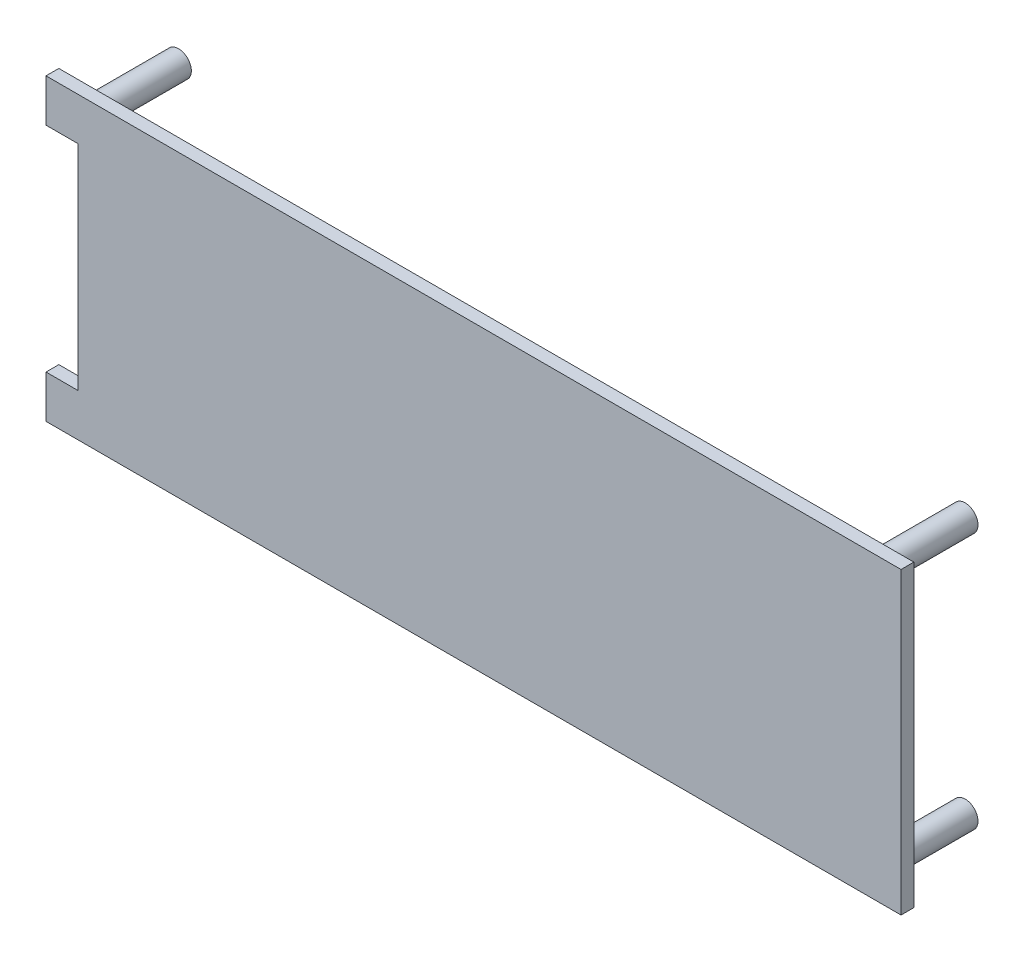
ISO-10303-21;
HEADER;
FILE_DESCRIPTION(('STEP AP214'),'2;1');
FILE_NAME('part.step','',(''),(''),'','','');
FILE_SCHEMA(('AUTOMOTIVE_DESIGN { 1 0 10303 214 1 1 1 1 }'));
ENDSEC;
DATA;
#1=APPLICATION_CONTEXT('core data for automotive mechanical design processes');
#2=APPLICATION_PROTOCOL_DEFINITION('international standard','automotive_design',2000,#1);
#3=PRODUCT_CONTEXT('',#1,'mechanical');
#4=PRODUCT('Part','Part','',(#3));
#5=PRODUCT_RELATED_PRODUCT_CATEGORY('part','',(#4));
#6=PRODUCT_DEFINITION_FORMATION('','',#4);
#7=PRODUCT_DEFINITION_CONTEXT('part definition',#1,'design');
#8=PRODUCT_DEFINITION('design','',#6,#7);
#9=PRODUCT_DEFINITION_SHAPE('','',#8);
#10=(LENGTH_UNIT() NAMED_UNIT(*) SI_UNIT(.MILLI.,.METRE.));
#11=(NAMED_UNIT(*) PLANE_ANGLE_UNIT() SI_UNIT($,.RADIAN.));
#12=(NAMED_UNIT(*) SI_UNIT($,.STERADIAN.) SOLID_ANGLE_UNIT());
#13=UNCERTAINTY_MEASURE_WITH_UNIT(LENGTH_MEASURE(1.E-05),#10,'distance_accuracy_value','');
#14=(GEOMETRIC_REPRESENTATION_CONTEXT(3) GLOBAL_UNCERTAINTY_ASSIGNED_CONTEXT((#13)) GLOBAL_UNIT_ASSIGNED_CONTEXT((#10,
#11,#12)) REPRESENTATION_CONTEXT('',''));
#15=CARTESIAN_POINT('',(0.,0.,0.));
#16=DIRECTION('',(0.,0.,1.));
#17=DIRECTION('',(1.,0.,0.));
#18=AXIS2_PLACEMENT_3D('',#15,#16,#17);
#19=CARTESIAN_POINT('',(0.,35.,23.));
#20=DIRECTION('',(1.,0.,0.));
#21=DIRECTION('',(0.,0.,-1.));
#22=AXIS2_PLACEMENT_3D('',#19,#20,#21);
#23=PLANE('',#22);
#24=DIRECTION('',(0.,-1.,0.));
#25=VECTOR('',#24,1.);
#26=CARTESIAN_POINT('',(0.,35.,23.));
#27=LINE('',#26,#25);
#28=CARTESIAN_POINT('',(0.,-25.,23.));
#29=VERTEX_POINT('',#28);
#30=CARTESIAN_POINT('',(0.,-35.,23.));
#31=VERTEX_POINT('',#30);
#32=EDGE_CURVE('E84',#29,#31,#27,.T.);
#33=ORIENTED_EDGE('',*,*,#32,.F.);
#34=DIRECTION('',(0.,0.,-1.));
#35=VECTOR('',#34,1.);
#36=CARTESIAN_POINT('',(0.,-25.,23.));
#37=LINE('',#36,#35);
#38=CARTESIAN_POINT('',(0.,-25.,20.));
#39=VERTEX_POINT('',#38);
#40=EDGE_CURVE('E135',#29,#39,#37,.T.);
#41=ORIENTED_EDGE('',*,*,#40,.T.);
#42=DIRECTION('',(0.,-1.,0.));
#43=VECTOR('',#42,1.);
#44=CARTESIAN_POINT('',(0.,35.,20.));
#45=LINE('',#44,#43);
#46=CARTESIAN_POINT('',(0.,-35.,20.));
#47=VERTEX_POINT('',#46);
#48=EDGE_CURVE('E147',#39,#47,#45,.T.);
#49=ORIENTED_EDGE('',*,*,#48,.T.);
#50=DIRECTION('',(0.,0.,-1.));
#51=VECTOR('',#50,1.);
#52=CARTESIAN_POINT('',(0.,-35.,23.));
#53=LINE('',#52,#51);
#54=EDGE_CURVE('E169',#31,#47,#53,.T.);
#55=ORIENTED_EDGE('',*,*,#54,.F.);
#56=EDGE_LOOP('',(#33,#41,#49,#55));
#57=FACE_BOUND('',#56,.T.);
#58=ADVANCED_FACE('F32',(#57),#23,.F.);
#59=CARTESIAN_POINT('',(192.,-30.,20.));
#60=DIRECTION('',(0.,0.,-1.));
#61=DIRECTION('',(-1.,0.,0.));
#62=AXIS2_PLACEMENT_3D('',#59,#60,#61);
#63=CYLINDRICAL_SURFACE('',#62,2.99999999999999);
#64=CARTESIAN_POINT('',(192.,-30.,20.));
#65=DIRECTION('',(0.,0.,1.));
#66=DIRECTION('',(1.,0.,0.));
#67=AXIS2_PLACEMENT_3D('',#64,#65,#66);
#68=CIRCLE('',#67,2.99999999999999);
#69=CARTESIAN_POINT('',(195.,-30.,20.));
#70=VERTEX_POINT('',#69);
#71=EDGE_CURVE('E173',#70,#70,#68,.T.);
#72=ORIENTED_EDGE('',*,*,#71,.F.);
#73=EDGE_LOOP('',(#72));
#74=FACE_BOUND('',#73,.T.);
#75=CARTESIAN_POINT('',(192.,-30.,0.));
#76=DIRECTION('',(0.,0.,1.));
#77=DIRECTION('',(1.,0.,0.));
#78=AXIS2_PLACEMENT_3D('',#75,#76,#77);
#79=CIRCLE('',#78,2.99999999999999);
#80=CARTESIAN_POINT('',(195.,-30.,0.));
#81=VERTEX_POINT('',#80);
#82=EDGE_CURVE('E172',#81,#81,#79,.T.);
#83=ORIENTED_EDGE('',*,*,#82,.T.);
#84=EDGE_LOOP('',(#83));
#85=FACE_BOUND('',#84,.T.);
#86=ADVANCED_FACE('F34',(#74,#85),#63,.T.);
#87=CARTESIAN_POINT('',(192.,-30.,0.));
#88=DIRECTION('',(0.,0.,1.));
#89=DIRECTION('',(1.,0.,0.));
#90=AXIS2_PLACEMENT_3D('',#87,#88,#89);
#91=PLANE('',#90);
#92=ORIENTED_EDGE('',*,*,#82,.F.);
#93=EDGE_LOOP('',(#92));
#94=FACE_BOUND('',#93,.T.);
#95=ADVANCED_FACE('F202',(#94),#91,.F.);
#96=CARTESIAN_POINT('',(0.,35.,20.));
#97=VERTEX_POINT('',#96);
#98=CARTESIAN_POINT('',(0.,25.,20.));
#99=VERTEX_POINT('',#98);
#100=EDGE_CURVE('E156',#97,#99,#45,.T.);
#101=ORIENTED_EDGE('',*,*,#100,.T.);
#102=DIRECTION('',(0.,0.,1.));
#103=VECTOR('',#102,1.);
#104=CARTESIAN_POINT('',(0.,25.,23.));
#105=LINE('',#104,#103);
#106=CARTESIAN_POINT('',(0.,25.,23.));
#107=VERTEX_POINT('',#106);
#108=EDGE_CURVE('E47',#99,#107,#105,.T.);
#109=ORIENTED_EDGE('',*,*,#108,.T.);
#110=CARTESIAN_POINT('',(0.,35.,23.));
#111=VERTEX_POINT('',#110);
#112=EDGE_CURVE('E148',#111,#107,#27,.T.);
#113=ORIENTED_EDGE('',*,*,#112,.F.);
#114=DIRECTION('',(0.,0.,-1.));
#115=VECTOR('',#114,1.);
#116=CARTESIAN_POINT('',(0.,35.,23.));
#117=LINE('',#116,#115);
#118=EDGE_CURVE('E155',#111,#97,#117,.T.);
#119=ORIENTED_EDGE('',*,*,#118,.T.);
#120=EDGE_LOOP('',(#101,#109,#113,#119));
#121=FACE_BOUND('',#120,.T.);
#122=ADVANCED_FACE('F206',(#121),#23,.F.);
#123=CARTESIAN_POINT('',(0.,-35.,23.));
#124=DIRECTION('',(0.,1.,0.));
#125=DIRECTION('',(0.,0.,1.));
#126=AXIS2_PLACEMENT_3D('',#123,#124,#125);
#127=PLANE('',#126);
#128=DIRECTION('',(1.,0.,0.));
#129=VECTOR('',#128,1.);
#130=CARTESIAN_POINT('',(0.,-35.,20.));
#131=LINE('',#130,#129);
#132=CARTESIAN_POINT('',(200.,-35.,20.));
#133=VERTEX_POINT('',#132);
#134=EDGE_CURVE('E158',#47,#133,#131,.T.);
#135=ORIENTED_EDGE('',*,*,#134,.T.);
#136=DIRECTION('',(0.,0.,-1.));
#137=VECTOR('',#136,1.);
#138=CARTESIAN_POINT('',(200.,-35.,23.));
#139=LINE('',#138,#137);
#140=CARTESIAN_POINT('',(200.,-35.,23.));
#141=VERTEX_POINT('',#140);
#142=EDGE_CURVE('E166',#141,#133,#139,.T.);
#143=ORIENTED_EDGE('',*,*,#142,.F.);
#144=DIRECTION('',(1.,0.,0.));
#145=VECTOR('',#144,1.);
#146=CARTESIAN_POINT('',(0.,-35.,23.));
#147=LINE('',#146,#145);
#148=EDGE_CURVE('E150',#31,#141,#147,.T.);
#149=ORIENTED_EDGE('',*,*,#148,.F.);
#150=ORIENTED_EDGE('',*,*,#54,.T.);
#151=EDGE_LOOP('',(#135,#143,#149,#150));
#152=FACE_BOUND('',#151,.T.);
#153=ADVANCED_FACE('F210',(#152),#127,.F.);
#154=CARTESIAN_POINT('',(200.,35.,23.));
#155=DIRECTION('',(-1.,0.,0.));
#156=DIRECTION('',(0.,0.,1.));
#157=AXIS2_PLACEMENT_3D('',#154,#155,#156);
#158=PLANE('',#157);
#159=DIRECTION('',(0.,1.,0.));
#160=VECTOR('',#159,1.);
#161=CARTESIAN_POINT('',(200.,35.,20.));
#162=LINE('',#161,#160);
#163=CARTESIAN_POINT('',(200.,35.,20.));
#164=VERTEX_POINT('',#163);
#165=EDGE_CURVE('E160',#133,#164,#162,.T.);
#166=ORIENTED_EDGE('',*,*,#165,.T.);
#167=DIRECTION('',(0.,0.,-1.));
#168=VECTOR('',#167,1.);
#169=CARTESIAN_POINT('',(200.,35.,23.));
#170=LINE('',#169,#168);
#171=CARTESIAN_POINT('',(200.,35.,23.));
#172=VERTEX_POINT('',#171);
#173=EDGE_CURVE('E164',#172,#164,#170,.T.);
#174=ORIENTED_EDGE('',*,*,#173,.F.);
#175=DIRECTION('',(0.,1.,0.));
#176=VECTOR('',#175,1.);
#177=CARTESIAN_POINT('',(200.,35.,23.));
#178=LINE('',#177,#176);
#179=EDGE_CURVE('E152',#141,#172,#178,.T.);
#180=ORIENTED_EDGE('',*,*,#179,.F.);
#181=ORIENTED_EDGE('',*,*,#142,.T.);
#182=EDGE_LOOP('',(#166,#174,#180,#181));
#183=FACE_BOUND('',#182,.T.);
#184=ADVANCED_FACE('F220',(#183),#158,.F.);
#185=CARTESIAN_POINT('',(0.,35.,23.));
#186=DIRECTION('',(0.,-1.,0.));
#187=DIRECTION('',(0.,0.,-1.));
#188=AXIS2_PLACEMENT_3D('',#185,#186,#187);
#189=PLANE('',#188);
#190=DIRECTION('',(-1.,0.,0.));
#191=VECTOR('',#190,1.);
#192=CARTESIAN_POINT('',(0.,35.,20.));
#193=LINE('',#192,#191);
#194=EDGE_CURVE('E77',#164,#97,#193,.T.);
#195=ORIENTED_EDGE('',*,*,#194,.T.);
#196=ORIENTED_EDGE('',*,*,#118,.F.);
#197=DIRECTION('',(-1.,0.,0.));
#198=VECTOR('',#197,1.);
#199=CARTESIAN_POINT('',(0.,35.,23.));
#200=LINE('',#199,#198);
#201=EDGE_CURVE('E56',#172,#111,#200,.T.);
#202=ORIENTED_EDGE('',*,*,#201,.F.);
#203=ORIENTED_EDGE('',*,*,#173,.T.);
#204=EDGE_LOOP('',(#195,#196,#202,#203));
#205=FACE_BOUND('',#204,.T.);
#206=ADVANCED_FACE('F224',(#205),#189,.F.);
#207=CARTESIAN_POINT('',(0.,0.,23.));
#208=DIRECTION('',(0.,0.,1.));
#209=DIRECTION('',(1.,0.,0.));
#210=AXIS2_PLACEMENT_3D('',#207,#208,#209);
#211=PLANE('',#210);
#212=DIRECTION('',(1.,0.,0.));
#213=VECTOR('',#212,1.);
#214=CARTESIAN_POINT('',(-7.44943760953019,-25.,23.));
#215=LINE('',#214,#213);
#216=CARTESIAN_POINT('',(7.44943760953019,-25.,23.));
#217=VERTEX_POINT('',#216);
#218=EDGE_CURVE('E126',#29,#217,#215,.T.);
#219=ORIENTED_EDGE('',*,*,#218,.F.);
#220=ORIENTED_EDGE('',*,*,#32,.T.);
#221=ORIENTED_EDGE('',*,*,#148,.T.);
#222=ORIENTED_EDGE('',*,*,#179,.T.);
#223=ORIENTED_EDGE('',*,*,#201,.T.);
#224=ORIENTED_EDGE('',*,*,#112,.T.);
#225=DIRECTION('',(-1.,0.,0.));
#226=VECTOR('',#225,1.);
#227=CARTESIAN_POINT('',(-7.44943760953019,25.,23.));
#228=LINE('',#227,#226);
#229=CARTESIAN_POINT('',(7.44943760953019,25.,23.));
#230=VERTEX_POINT('',#229);
#231=EDGE_CURVE('E128',#230,#107,#228,.T.);
#232=ORIENTED_EDGE('',*,*,#231,.F.);
#233=DIRECTION('',(0.,1.,0.));
#234=VECTOR('',#233,1.);
#235=CARTESIAN_POINT('',(7.44943760953019,-25.,23.));
#236=LINE('',#235,#234);
#237=EDGE_CURVE('E114',#217,#230,#236,.T.);
#238=ORIENTED_EDGE('',*,*,#237,.F.);
#239=EDGE_LOOP('',(#219,#220,#221,#222,#223,#224,#232,#238));
#240=FACE_BOUND('',#239,.T.);
#241=ADVANCED_FACE('F192',(#240),#211,.T.);
#242=CARTESIAN_POINT('',(0.,0.,20.));
#243=DIRECTION('',(0.,0.,1.));
#244=DIRECTION('',(1.,0.,0.));
#245=AXIS2_PLACEMENT_3D('',#242,#243,#244);
#246=PLANE('',#245);
#247=CARTESIAN_POINT('',(8.,-30.,20.));
#248=DIRECTION('',(0.,0.,1.));
#249=DIRECTION('',(1.,0.,0.));
#250=AXIS2_PLACEMENT_3D('',#247,#248,#249);
#251=CIRCLE('',#250,3.);
#252=CARTESIAN_POINT('',(11.,-30.,20.));
#253=VERTEX_POINT('',#252);
#254=EDGE_CURVE('E40',#253,#253,#251,.F.);
#255=ORIENTED_EDGE('',*,*,#254,.F.);
#256=EDGE_LOOP('',(#255));
#257=FACE_BOUND('',#256,.T.);
#258=CARTESIAN_POINT('',(8.,30.,20.));
#259=DIRECTION('',(0.,0.,1.));
#260=DIRECTION('',(1.,0.,0.));
#261=AXIS2_PLACEMENT_3D('',#258,#259,#260);
#262=CIRCLE('',#261,3.);
#263=CARTESIAN_POINT('',(11.,30.,20.));
#264=VERTEX_POINT('',#263);
#265=EDGE_CURVE('E181',#264,#264,#262,.F.);
#266=ORIENTED_EDGE('',*,*,#265,.F.);
#267=EDGE_LOOP('',(#266));
#268=FACE_BOUND('',#267,.T.);
#269=CARTESIAN_POINT('',(192.,30.,20.));
#270=DIRECTION('',(0.,0.,1.));
#271=DIRECTION('',(1.,0.,0.));
#272=AXIS2_PLACEMENT_3D('',#269,#270,#271);
#273=CIRCLE('',#272,2.99999999999999);
#274=CARTESIAN_POINT('',(195.,30.,20.));
#275=VERTEX_POINT('',#274);
#276=EDGE_CURVE('E176',#275,#275,#273,.F.);
#277=ORIENTED_EDGE('',*,*,#276,.F.);
#278=EDGE_LOOP('',(#277));
#279=FACE_BOUND('',#278,.T.);
#280=ORIENTED_EDGE('',*,*,#71,.T.);
#281=EDGE_LOOP('',(#280));
#282=FACE_BOUND('',#281,.T.);
#283=ORIENTED_EDGE('',*,*,#48,.F.);
#284=DIRECTION('',(1.,0.,0.));
#285=VECTOR('',#284,1.);
#286=CARTESIAN_POINT('',(0.,-25.,20.));
#287=LINE('',#286,#285);
#288=CARTESIAN_POINT('',(7.44943760953019,-25.,20.));
#289=VERTEX_POINT('',#288);
#290=EDGE_CURVE('E11',#39,#289,#287,.T.);
#291=ORIENTED_EDGE('',*,*,#290,.T.);
#292=DIRECTION('',(0.,1.,0.));
#293=VECTOR('',#292,1.);
#294=CARTESIAN_POINT('',(7.44943760953019,-25.,20.));
#295=LINE('',#294,#293);
#296=CARTESIAN_POINT('',(7.44943760953019,25.,20.));
#297=VERTEX_POINT('',#296);
#298=EDGE_CURVE('E112',#289,#297,#295,.T.);
#299=ORIENTED_EDGE('',*,*,#298,.T.);
#300=DIRECTION('',(-1.,0.,0.));
#301=VECTOR('',#300,1.);
#302=CARTESIAN_POINT('',(-7.44943760953019,25.,20.));
#303=LINE('',#302,#301);
#304=EDGE_CURVE('E117',#297,#99,#303,.T.);
#305=ORIENTED_EDGE('',*,*,#304,.T.);
#306=ORIENTED_EDGE('',*,*,#100,.F.);
#307=ORIENTED_EDGE('',*,*,#194,.F.);
#308=ORIENTED_EDGE('',*,*,#165,.F.);
#309=ORIENTED_EDGE('',*,*,#134,.F.);
#310=EDGE_LOOP('',(#283,#291,#299,#305,#306,#307,#308,#309));
#311=FACE_BOUND('',#310,.T.);
#312=ADVANCED_FACE('F125',(#257,#268,#279,#282,#311),#246,.F.);
#313=CARTESIAN_POINT('',(192.,30.,20.));
#314=DIRECTION('',(0.,0.,-1.));
#315=DIRECTION('',(-1.,0.,0.));
#316=AXIS2_PLACEMENT_3D('',#313,#314,#315);
#317=CYLINDRICAL_SURFACE('',#316,2.99999999999999);
#318=ORIENTED_EDGE('',*,*,#276,.T.);
#319=EDGE_LOOP('',(#318));
#320=FACE_BOUND('',#319,.T.);
#321=CARTESIAN_POINT('',(192.,30.,0.));
#322=DIRECTION('',(0.,0.,1.));
#323=DIRECTION('',(1.,0.,0.));
#324=AXIS2_PLACEMENT_3D('',#321,#322,#323);
#325=CIRCLE('',#324,2.99999999999999);
#326=CARTESIAN_POINT('',(195.,30.,0.));
#327=VERTEX_POINT('',#326);
#328=EDGE_CURVE('E144',#327,#327,#325,.T.);
#329=ORIENTED_EDGE('',*,*,#328,.T.);
#330=EDGE_LOOP('',(#329));
#331=FACE_BOUND('',#330,.T.);
#332=ADVANCED_FACE('F191',(#320,#331),#317,.T.);
#333=CARTESIAN_POINT('',(192.,30.,0.));
#334=DIRECTION('',(0.,0.,1.));
#335=DIRECTION('',(1.,0.,0.));
#336=AXIS2_PLACEMENT_3D('',#333,#334,#335);
#337=PLANE('',#336);
#338=ORIENTED_EDGE('',*,*,#328,.F.);
#339=EDGE_LOOP('',(#338));
#340=FACE_BOUND('',#339,.T.);
#341=ADVANCED_FACE('F232',(#340),#337,.F.);
#342=CARTESIAN_POINT('',(8.,30.,20.));
#343=DIRECTION('',(0.,0.,-1.));
#344=DIRECTION('',(-1.,0.,0.));
#345=AXIS2_PLACEMENT_3D('',#342,#343,#344);
#346=CYLINDRICAL_SURFACE('',#345,3.);
#347=ORIENTED_EDGE('',*,*,#265,.T.);
#348=EDGE_LOOP('',(#347));
#349=FACE_BOUND('',#348,.T.);
#350=CARTESIAN_POINT('',(8.,30.,0.));
#351=DIRECTION('',(0.,0.,1.));
#352=DIRECTION('',(1.,0.,0.));
#353=AXIS2_PLACEMENT_3D('',#350,#351,#352);
#354=CIRCLE('',#353,3.);
#355=CARTESIAN_POINT('',(11.,30.,0.));
#356=VERTEX_POINT('',#355);
#357=EDGE_CURVE('E141',#356,#356,#354,.T.);
#358=ORIENTED_EDGE('',*,*,#357,.T.);
#359=EDGE_LOOP('',(#358));
#360=FACE_BOUND('',#359,.T.);
#361=ADVANCED_FACE('F236',(#349,#360),#346,.T.);
#362=CARTESIAN_POINT('',(8.,30.,0.));
#363=DIRECTION('',(0.,0.,1.));
#364=DIRECTION('',(1.,0.,0.));
#365=AXIS2_PLACEMENT_3D('',#362,#363,#364);
#366=PLANE('',#365);
#367=ORIENTED_EDGE('',*,*,#357,.F.);
#368=EDGE_LOOP('',(#367));
#369=FACE_BOUND('',#368,.T.);
#370=ADVANCED_FACE('F240',(#369),#366,.F.);
#371=CARTESIAN_POINT('',(8.,-30.,20.));
#372=DIRECTION('',(0.,0.,-1.));
#373=DIRECTION('',(-1.,0.,0.));
#374=AXIS2_PLACEMENT_3D('',#371,#372,#373);
#375=CYLINDRICAL_SURFACE('',#374,3.);
#376=ORIENTED_EDGE('',*,*,#254,.T.);
#377=EDGE_LOOP('',(#376));
#378=FACE_BOUND('',#377,.T.);
#379=CARTESIAN_POINT('',(8.,-30.,0.));
#380=DIRECTION('',(0.,0.,1.));
#381=DIRECTION('',(1.,0.,0.));
#382=AXIS2_PLACEMENT_3D('',#379,#380,#381);
#383=CIRCLE('',#382,3.);
#384=CARTESIAN_POINT('',(11.,-30.,0.));
#385=VERTEX_POINT('',#384);
#386=EDGE_CURVE('E138',#385,#385,#383,.T.);
#387=ORIENTED_EDGE('',*,*,#386,.T.);
#388=EDGE_LOOP('',(#387));
#389=FACE_BOUND('',#388,.T.);
#390=ADVANCED_FACE('F186',(#378,#389),#375,.T.);
#391=CARTESIAN_POINT('',(8.,-30.,0.));
#392=DIRECTION('',(0.,0.,1.));
#393=DIRECTION('',(1.,0.,0.));
#394=AXIS2_PLACEMENT_3D('',#391,#392,#393);
#395=PLANE('',#394);
#396=ORIENTED_EDGE('',*,*,#386,.F.);
#397=EDGE_LOOP('',(#396));
#398=FACE_BOUND('',#397,.T.);
#399=ADVANCED_FACE('F247',(#398),#395,.F.);
#400=CARTESIAN_POINT('',(-7.44943760953019,-25.,20.));
#401=DIRECTION('',(0.,-1.,0.));
#402=DIRECTION('',(0.,0.,-1.));
#403=AXIS2_PLACEMENT_3D('',#400,#401,#402);
#404=PLANE('',#403);
#405=ORIENTED_EDGE('',*,*,#218,.T.);
#406=DIRECTION('',(0.,0.,1.));
#407=VECTOR('',#406,1.);
#408=CARTESIAN_POINT('',(7.44943760953019,-25.,20.));
#409=LINE('',#408,#407);
#410=EDGE_CURVE('E116',#289,#217,#409,.T.);
#411=ORIENTED_EDGE('',*,*,#410,.F.);
#412=ORIENTED_EDGE('',*,*,#290,.F.);
#413=ORIENTED_EDGE('',*,*,#40,.F.);
#414=EDGE_LOOP('',(#405,#411,#412,#413));
#415=FACE_BOUND('',#414,.T.);
#416=ADVANCED_FACE('F250',(#415),#404,.F.);
#417=CARTESIAN_POINT('',(-7.44943760953019,25.,20.));
#418=DIRECTION('',(0.,1.,0.));
#419=DIRECTION('',(-1.,0.,0.));
#420=AXIS2_PLACEMENT_3D('',#417,#418,#419);
#421=PLANE('',#420);
#422=ORIENTED_EDGE('',*,*,#304,.F.);
#423=DIRECTION('',(0.,0.,1.));
#424=VECTOR('',#423,1.);
#425=CARTESIAN_POINT('',(7.44943760953019,25.,20.));
#426=LINE('',#425,#424);
#427=EDGE_CURVE('E108',#297,#230,#426,.T.);
#428=ORIENTED_EDGE('',*,*,#427,.T.);
#429=ORIENTED_EDGE('',*,*,#231,.T.);
#430=ORIENTED_EDGE('',*,*,#108,.F.);
#431=EDGE_LOOP('',(#422,#428,#429,#430));
#432=FACE_BOUND('',#431,.T.);
#433=ADVANCED_FACE('F119',(#432),#421,.F.);
#434=CARTESIAN_POINT('',(7.44943760953019,-25.,20.));
#435=DIRECTION('',(1.,0.,0.));
#436=DIRECTION('',(0.,0.,-1.));
#437=AXIS2_PLACEMENT_3D('',#434,#435,#436);
#438=PLANE('',#437);
#439=ORIENTED_EDGE('',*,*,#237,.T.);
#440=ORIENTED_EDGE('',*,*,#427,.F.);
#441=ORIENTED_EDGE('',*,*,#298,.F.);
#442=ORIENTED_EDGE('',*,*,#410,.T.);
#443=EDGE_LOOP('',(#439,#440,#441,#442));
#444=FACE_BOUND('',#443,.T.);
#445=ADVANCED_FACE('F109',(#444),#438,.F.);
#446=CLOSED_SHELL('',(#58,#86,#95,#122,#153,#184,#206,#241,#312,#332,#341,#361,#370,#390,#399,
#416,#433,#445));
#447=MANIFOLD_SOLID_BREP('B2',#446);
#448=ADVANCED_BREP_SHAPE_REPRESENTATION('',(#18,#447),#14);
#449=SHAPE_DEFINITION_REPRESENTATION(#9,#448);
ENDSEC;
END-ISO-10303-21;
